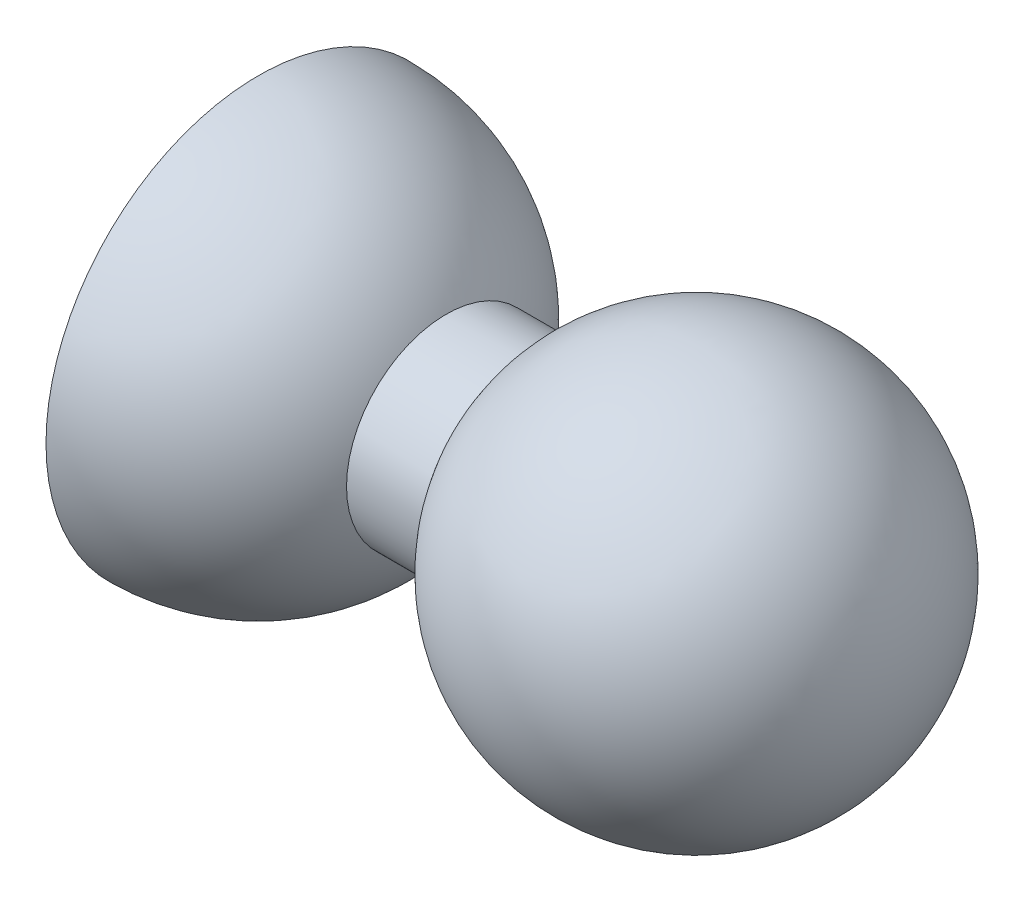
ISO-10303-21;
HEADER;
FILE_DESCRIPTION(('STEP AP214'),'2;1');
FILE_NAME('part.step','',(''),(''),'','','');
FILE_SCHEMA(('AUTOMOTIVE_DESIGN { 1 0 10303 214 1 1 1 1 }'));
ENDSEC;
DATA;
#1=APPLICATION_CONTEXT('core data for automotive mechanical design processes');
#2=APPLICATION_PROTOCOL_DEFINITION('international standard','automotive_design',2000,#1);
#3=PRODUCT_CONTEXT('',#1,'mechanical');
#4=PRODUCT('Part','Part','',(#3));
#5=PRODUCT_RELATED_PRODUCT_CATEGORY('part','',(#4));
#6=PRODUCT_DEFINITION_FORMATION('','',#4);
#7=PRODUCT_DEFINITION_CONTEXT('part definition',#1,'design');
#8=PRODUCT_DEFINITION('design','',#6,#7);
#9=PRODUCT_DEFINITION_SHAPE('','',#8);
#10=(LENGTH_UNIT() NAMED_UNIT(*) SI_UNIT(.MILLI.,.METRE.));
#11=(NAMED_UNIT(*) PLANE_ANGLE_UNIT() SI_UNIT($,.RADIAN.));
#12=(NAMED_UNIT(*) SI_UNIT($,.STERADIAN.) SOLID_ANGLE_UNIT());
#13=UNCERTAINTY_MEASURE_WITH_UNIT(LENGTH_MEASURE(1.E-05),#10,'distance_accuracy_value','');
#14=(GEOMETRIC_REPRESENTATION_CONTEXT(3) GLOBAL_UNCERTAINTY_ASSIGNED_CONTEXT((#13)) GLOBAL_UNIT_ASSIGNED_CONTEXT((#10,
#11,#12)) REPRESENTATION_CONTEXT('',''));
#15=CARTESIAN_POINT('',(0.,0.,0.));
#16=DIRECTION('',(0.,0.,1.));
#17=DIRECTION('',(1.,0.,0.));
#18=AXIS2_PLACEMENT_3D('',#15,#16,#17);
#19=CARTESIAN_POINT('',(0.,0.,0.));
#20=DIRECTION('',(-1.,0.,0.));
#21=DIRECTION('',(0.,1.,0.));
#22=AXIS2_PLACEMENT_3D('',#19,#20,#21);
#23=SPHERICAL_SURFACE('',#22,16.);
#24=CARTESIAN_POINT('',(0.,0.,0.));
#25=DIRECTION('',(-1.,0.,0.));
#26=DIRECTION('',(0.,0.,1.));
#27=AXIS2_PLACEMENT_3D('',#24,#25,#26);
#28=CIRCLE('',#27,16.);
#29=CARTESIAN_POINT('',(0.,0.,16.));
#30=VERTEX_POINT('',#29);
#31=EDGE_CURVE('E50',#30,#30,#28,.T.);
#32=ORIENTED_EDGE('',*,*,#31,.F.);
#33=EDGE_LOOP('',(#32));
#34=FACE_BOUND('',#33,.T.);
#35=CARTESIAN_POINT('',(14.1332940251026,0.,0.));
#36=DIRECTION('',(-1.,0.,0.));
#37=DIRECTION('',(0.,0.,1.));
#38=AXIS2_PLACEMENT_3D('',#35,#36,#37);
#39=CIRCLE('',#38,7.5);
#40=CARTESIAN_POINT('',(14.1332940251026,0.,7.5));
#41=VERTEX_POINT('',#40);
#42=EDGE_CURVE('E10',#41,#41,#39,.F.);
#43=ORIENTED_EDGE('',*,*,#42,.F.);
#44=EDGE_LOOP('',(#43));
#45=FACE_BOUND('',#44,.T.);
#46=ADVANCED_FACE('F43',(#34,#45),#23,.T.);
#47=CARTESIAN_POINT('',(0.,15.,0.));
#48=DIRECTION('',(-1.,0.,0.));
#49=DIRECTION('',(0.,0.,1.));
#50=AXIS2_PLACEMENT_3D('',#47,#48,#49);
#51=PLANE('',#50);
#52=ORIENTED_EDGE('',*,*,#31,.T.);
#53=EDGE_LOOP('',(#52));
#54=FACE_BOUND('',#53,.T.);
#55=CARTESIAN_POINT('',(0.,0.,0.));
#56=DIRECTION('',(-1.,0.,0.));
#57=DIRECTION('',(0.,0.,1.));
#58=AXIS2_PLACEMENT_3D('',#55,#56,#57);
#59=CIRCLE('',#58,15.);
#60=CARTESIAN_POINT('',(0.,0.,15.));
#61=VERTEX_POINT('',#60);
#62=EDGE_CURVE('E55',#61,#61,#59,.T.);
#63=ORIENTED_EDGE('',*,*,#62,.F.);
#64=EDGE_LOOP('',(#63));
#65=FACE_BOUND('',#64,.T.);
#66=ADVANCED_FACE('F78',(#54,#65),#51,.T.);
#67=CARTESIAN_POINT('',(0.,0.,0.));
#68=DIRECTION('',(-1.,0.,0.));
#69=DIRECTION('',(0.,1.,0.));
#70=AXIS2_PLACEMENT_3D('',#67,#68,#69);
#71=SPHERICAL_SURFACE('',#70,15.);
#72=ORIENTED_EDGE('',*,*,#62,.T.);
#73=EDGE_LOOP('',(#72));
#74=FACE_BOUND('',#73,.T.);
#75=ADVANCED_FACE('F75',(#74),#71,.F.);
#76=CARTESIAN_POINT('',(-16.001,0.,0.));
#77=DIRECTION('',(1.,0.,0.));
#78=DIRECTION('',(0.,0.,-1.));
#79=AXIS2_PLACEMENT_3D('',#76,#77,#78);
#80=CYLINDRICAL_SURFACE('',#79,7.5);
#81=CARTESIAN_POINT('',(20.,0.,0.));
#82=DIRECTION('',(-1.,0.,0.));
#83=DIRECTION('',(0.,0.,1.));
#84=AXIS2_PLACEMENT_3D('',#81,#82,#83);
#85=CIRCLE('',#84,7.5);
#86=CARTESIAN_POINT('',(20.,0.,7.5));
#87=VERTEX_POINT('',#86);
#88=EDGE_CURVE('E60',#87,#87,#85,.T.);
#89=ORIENTED_EDGE('',*,*,#88,.T.);
#90=EDGE_LOOP('',(#89));
#91=FACE_BOUND('',#90,.T.);
#92=ORIENTED_EDGE('',*,*,#42,.T.);
#93=EDGE_LOOP('',(#92));
#94=FACE_BOUND('',#93,.T.);
#95=ADVANCED_FACE('F67',(#91,#94),#80,.T.);
#96=CARTESIAN_POINT('',(32.9903810567666,0.,0.));
#97=DIRECTION('',(-1.,0.,0.));
#98=DIRECTION('',(0.,1.,0.));
#99=AXIS2_PLACEMENT_3D('',#96,#97,#98);
#100=SPHERICAL_SURFACE('',#99,15.);
#101=ORIENTED_EDGE('',*,*,#88,.F.);
#102=EDGE_LOOP('',(#101));
#103=FACE_BOUND('',#102,.T.);
#104=ADVANCED_FACE('F69',(#103),#100,.T.);
#105=CLOSED_SHELL('',(#46,#66,#75,#95,#104));
#106=MANIFOLD_SOLID_BREP('B2',#105);
#107=ADVANCED_BREP_SHAPE_REPRESENTATION('',(#18,#106),#14);
#108=SHAPE_DEFINITION_REPRESENTATION(#9,#107);
ENDSEC;
END-ISO-10303-21;
